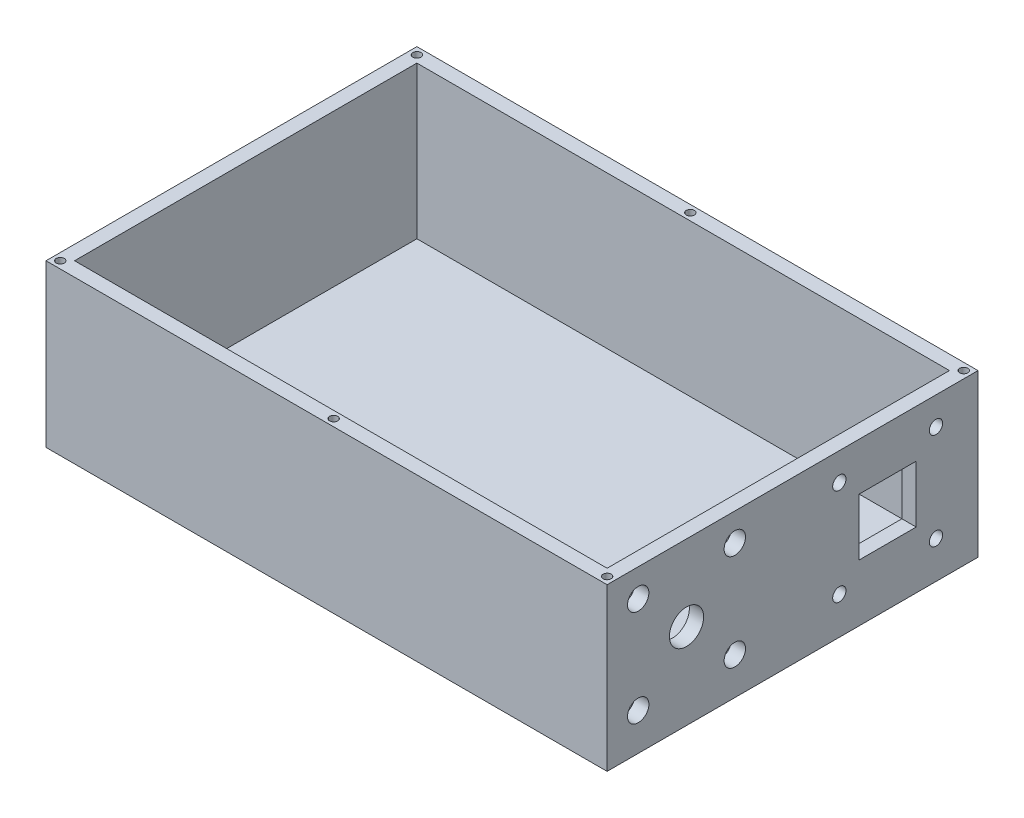
ISO-10303-21;
HEADER;
FILE_DESCRIPTION(('STEP AP214'),'2;1');
FILE_NAME('part.step','',(''),(''),'','','');
FILE_SCHEMA(('AUTOMOTIVE_DESIGN { 1 0 10303 214 1 1 1 1 }'));
ENDSEC;
DATA;
#1=APPLICATION_CONTEXT('core data for automotive mechanical design processes');
#2=APPLICATION_PROTOCOL_DEFINITION('international standard','automotive_design',2000,#1);
#3=PRODUCT_CONTEXT('',#1,'mechanical');
#4=PRODUCT('Part','Part','',(#3));
#5=PRODUCT_RELATED_PRODUCT_CATEGORY('part','',(#4));
#6=PRODUCT_DEFINITION_FORMATION('','',#4);
#7=PRODUCT_DEFINITION_CONTEXT('part definition',#1,'design');
#8=PRODUCT_DEFINITION('design','',#6,#7);
#9=PRODUCT_DEFINITION_SHAPE('','',#8);
#10=(LENGTH_UNIT() NAMED_UNIT(*) SI_UNIT(.MILLI.,.METRE.));
#11=(NAMED_UNIT(*) PLANE_ANGLE_UNIT() SI_UNIT($,.RADIAN.));
#12=(NAMED_UNIT(*) SI_UNIT($,.STERADIAN.) SOLID_ANGLE_UNIT());
#13=UNCERTAINTY_MEASURE_WITH_UNIT(LENGTH_MEASURE(1.E-05),#10,'distance_accuracy_value','');
#14=(GEOMETRIC_REPRESENTATION_CONTEXT(3) GLOBAL_UNCERTAINTY_ASSIGNED_CONTEXT((#13)) GLOBAL_UNIT_ASSIGNED_CONTEXT((#10,
#11,#12)) REPRESENTATION_CONTEXT('',''));
#15=CARTESIAN_POINT('',(0.,0.,0.));
#16=DIRECTION('',(0.,0.,1.));
#17=DIRECTION('',(1.,0.,0.));
#18=AXIS2_PLACEMENT_3D('',#15,#16,#17);
#19=CARTESIAN_POINT('',(59.,34.,-39.));
#20=DIRECTION('',(-1.,0.,0.));
#21=DIRECTION('',(0.,0.,1.));
#22=AXIS2_PLACEMENT_3D('',#19,#20,#21);
#23=PLANE('',#22);
#24=CARTESIAN_POINT('',(59.,28.16,32.46));
#25=DIRECTION('',(-1.,0.,0.));
#26=DIRECTION('',(0.,0.,1.));
#27=AXIS2_PLACEMENT_3D('',#24,#25,#26);
#28=CIRCLE('',#27,2.25);
#29=CARTESIAN_POINT('',(59.,28.16,34.71));
#30=VERTEX_POINT('',#29);
#31=EDGE_CURVE('E510',#30,#30,#28,.T.);
#32=ORIENTED_EDGE('',*,*,#31,.T.);
#33=EDGE_LOOP('',(#32));
#34=FACE_BOUND('',#33,.T.);
#35=CARTESIAN_POINT('',(59.,7.84,12.14));
#36=DIRECTION('',(-1.,0.,0.));
#37=DIRECTION('',(0.,0.,1.));
#38=AXIS2_PLACEMENT_3D('',#35,#36,#37);
#39=CIRCLE('',#38,2.25);
#40=CARTESIAN_POINT('',(59.,7.84,14.39));
#41=VERTEX_POINT('',#40);
#42=EDGE_CURVE('E518',#41,#41,#39,.T.);
#43=ORIENTED_EDGE('',*,*,#42,.T.);
#44=EDGE_LOOP('',(#43));
#45=FACE_BOUND('',#44,.T.);
#46=CARTESIAN_POINT('',(59.,7.84,32.46));
#47=DIRECTION('',(-1.,0.,0.));
#48=DIRECTION('',(0.,0.,1.));
#49=AXIS2_PLACEMENT_3D('',#46,#47,#48);
#50=CIRCLE('',#49,2.25);
#51=CARTESIAN_POINT('',(59.,7.84,34.71));
#52=VERTEX_POINT('',#51);
#53=EDGE_CURVE('E494',#52,#52,#50,.T.);
#54=ORIENTED_EDGE('',*,*,#53,.T.);
#55=EDGE_LOOP('',(#54));
#56=FACE_BOUND('',#55,.T.);
#57=CARTESIAN_POINT('',(59.,18.,22.3));
#58=DIRECTION('',(-1.,0.,0.));
#59=DIRECTION('',(0.,0.,1.));
#60=AXIS2_PLACEMENT_3D('',#57,#58,#59);
#61=CIRCLE('',#60,3.6);
#62=CARTESIAN_POINT('',(59.,18.,25.9));
#63=VERTEX_POINT('',#62);
#64=EDGE_CURVE('E503',#63,#63,#61,.T.);
#65=ORIENTED_EDGE('',*,*,#64,.T.);
#66=EDGE_LOOP('',(#65));
#67=FACE_BOUND('',#66,.T.);
#68=CARTESIAN_POINT('',(59.,28.16,12.14));
#69=DIRECTION('',(-1.,0.,0.));
#70=DIRECTION('',(0.,0.,1.));
#71=AXIS2_PLACEMENT_3D('',#68,#69,#70);
#72=CIRCLE('',#71,2.25);
#73=CARTESIAN_POINT('',(59.,28.16,14.39));
#74=VERTEX_POINT('',#73);
#75=EDGE_CURVE('E204',#74,#74,#72,.T.);
#76=ORIENTED_EDGE('',*,*,#75,.T.);
#77=EDGE_LOOP('',(#76));
#78=FACE_BOUND('',#77,.T.);
#79=CARTESIAN_POINT('',(59.,7.84,-9.84));
#80=DIRECTION('',(-1.,0.,0.));
#81=DIRECTION('',(0.,0.,1.));
#82=AXIS2_PLACEMENT_3D('',#79,#80,#81);
#83=CIRCLE('',#82,1.4);
#84=CARTESIAN_POINT('',(59.,7.84,-8.44));
#85=VERTEX_POINT('',#84);
#86=EDGE_CURVE('E196',#85,#85,#83,.T.);
#87=ORIENTED_EDGE('',*,*,#86,.T.);
#88=EDGE_LOOP('',(#87));
#89=FACE_BOUND('',#88,.T.);
#90=CARTESIAN_POINT('',(59.,7.84,-30.16));
#91=DIRECTION('',(-1.,0.,0.));
#92=DIRECTION('',(0.,0.,1.));
#93=AXIS2_PLACEMENT_3D('',#90,#91,#92);
#94=CIRCLE('',#93,1.4);
#95=CARTESIAN_POINT('',(59.,7.84,-28.76));
#96=VERTEX_POINT('',#95);
#97=EDGE_CURVE('E188',#96,#96,#94,.T.);
#98=ORIENTED_EDGE('',*,*,#97,.T.);
#99=EDGE_LOOP('',(#98));
#100=FACE_BOUND('',#99,.T.);
#101=CARTESIAN_POINT('',(59.,28.16,-9.84));
#102=DIRECTION('',(-1.,0.,0.));
#103=DIRECTION('',(0.,0.,1.));
#104=AXIS2_PLACEMENT_3D('',#101,#102,#103);
#105=CIRCLE('',#104,1.4);
#106=CARTESIAN_POINT('',(59.,28.16,-8.44));
#107=VERTEX_POINT('',#106);
#108=EDGE_CURVE('E166',#107,#107,#105,.T.);
#109=ORIENTED_EDGE('',*,*,#108,.T.);
#110=EDGE_LOOP('',(#109));
#111=FACE_BOUND('',#110,.T.);
#112=DIRECTION('',(0.,0.,1.));
#113=VECTOR('',#112,1.);
#114=CARTESIAN_POINT('',(59.,12.,-26.));
#115=LINE('',#114,#113);
#116=CARTESIAN_POINT('',(59.,12.,-26.));
#117=VERTEX_POINT('',#116);
#118=CARTESIAN_POINT('',(59.,12.,-14.));
#119=VERTEX_POINT('',#118);
#120=EDGE_CURVE('E138',#117,#119,#115,.T.);
#121=ORIENTED_EDGE('',*,*,#120,.T.);
#122=DIRECTION('',(0.,1.,0.));
#123=VECTOR('',#122,1.);
#124=CARTESIAN_POINT('',(59.,24.,-14.));
#125=LINE('',#124,#123);
#126=CARTESIAN_POINT('',(59.,24.,-14.));
#127=VERTEX_POINT('',#126);
#128=EDGE_CURVE('E131',#119,#127,#125,.T.);
#129=ORIENTED_EDGE('',*,*,#128,.T.);
#130=DIRECTION('',(0.,0.,-1.));
#131=VECTOR('',#130,1.);
#132=CARTESIAN_POINT('',(59.,24.,-26.));
#133=LINE('',#132,#131);
#134=CARTESIAN_POINT('',(59.,24.,-26.));
#135=VERTEX_POINT('',#134);
#136=EDGE_CURVE('E141',#127,#135,#133,.T.);
#137=ORIENTED_EDGE('',*,*,#136,.T.);
#138=DIRECTION('',(0.,-1.,0.));
#139=VECTOR('',#138,1.);
#140=CARTESIAN_POINT('',(59.,24.,-26.));
#141=LINE('',#140,#139);
#142=EDGE_CURVE('E55',#135,#117,#141,.T.);
#143=ORIENTED_EDGE('',*,*,#142,.T.);
#144=EDGE_LOOP('',(#121,#129,#137,#143));
#145=FACE_BOUND('',#144,.T.);
#146=CARTESIAN_POINT('',(59.,28.16,-30.16));
#147=DIRECTION('',(-1.,0.,0.));
#148=DIRECTION('',(0.,0.,1.));
#149=AXIS2_PLACEMENT_3D('',#146,#147,#148);
#150=CIRCLE('',#149,1.4);
#151=CARTESIAN_POINT('',(59.,28.16,-28.76));
#152=VERTEX_POINT('',#151);
#153=EDGE_CURVE('E205',#152,#152,#150,.T.);
#154=ORIENTED_EDGE('',*,*,#153,.T.);
#155=EDGE_LOOP('',(#154));
#156=FACE_BOUND('',#155,.T.);
#157=DIRECTION('',(0.,0.,-1.));
#158=VECTOR('',#157,1.);
#159=CARTESIAN_POINT('',(59.,0.,-39.));
#160=LINE('',#159,#158);
#161=CARTESIAN_POINT('',(59.,0.,39.));
#162=VERTEX_POINT('',#161);
#163=CARTESIAN_POINT('',(59.,0.,-39.));
#164=VERTEX_POINT('',#163);
#165=EDGE_CURVE('E247',#162,#164,#160,.T.);
#166=ORIENTED_EDGE('',*,*,#165,.T.);
#167=DIRECTION('',(0.,-1.,0.));
#168=VECTOR('',#167,1.);
#169=CARTESIAN_POINT('',(59.,34.,-39.));
#170=LINE('',#169,#168);
#171=CARTESIAN_POINT('',(59.,34.,-39.));
#172=VERTEX_POINT('',#171);
#173=EDGE_CURVE('E11',#172,#164,#170,.T.);
#174=ORIENTED_EDGE('',*,*,#173,.F.);
#175=DIRECTION('',(0.,0.,-1.));
#176=VECTOR('',#175,1.);
#177=CARTESIAN_POINT('',(59.,34.,-39.));
#178=LINE('',#177,#176);
#179=CARTESIAN_POINT('',(59.,34.,39.));
#180=VERTEX_POINT('',#179);
#181=EDGE_CURVE('E257',#180,#172,#178,.T.);
#182=ORIENTED_EDGE('',*,*,#181,.F.);
#183=DIRECTION('',(0.,-1.,0.));
#184=VECTOR('',#183,1.);
#185=CARTESIAN_POINT('',(59.,34.,39.));
#186=LINE('',#185,#184);
#187=EDGE_CURVE('E271',#180,#162,#186,.T.);
#188=ORIENTED_EDGE('',*,*,#187,.T.);
#189=EDGE_LOOP('',(#166,#174,#182,#188));
#190=FACE_BOUND('',#189,.T.);
#191=ADVANCED_FACE('F40',(#34,#45,#56,#67,#78,#89,#100,#111,#145,#156,#190),#23,.F.);
#192=CARTESIAN_POINT('',(-59.,34.,-39.));
#193=DIRECTION('',(0.,0.,1.));
#194=DIRECTION('',(1.,0.,0.));
#195=AXIS2_PLACEMENT_3D('',#192,#193,#194);
#196=PLANE('',#195);
#197=DIRECTION('',(-1.,0.,0.));
#198=VECTOR('',#197,1.);
#199=CARTESIAN_POINT('',(-59.,0.,-39.));
#200=LINE('',#199,#198);
#201=CARTESIAN_POINT('',(-59.,0.,-39.));
#202=VERTEX_POINT('',#201);
#203=EDGE_CURVE('E275',#164,#202,#200,.T.);
#204=ORIENTED_EDGE('',*,*,#203,.T.);
#205=DIRECTION('',(0.,-1.,0.));
#206=VECTOR('',#205,1.);
#207=CARTESIAN_POINT('',(-59.,34.,-39.));
#208=LINE('',#207,#206);
#209=CARTESIAN_POINT('',(-59.,34.,-39.));
#210=VERTEX_POINT('',#209);
#211=EDGE_CURVE('E48',#210,#202,#208,.T.);
#212=ORIENTED_EDGE('',*,*,#211,.F.);
#213=DIRECTION('',(-1.,0.,0.));
#214=VECTOR('',#213,1.);
#215=CARTESIAN_POINT('',(-59.,34.,-39.));
#216=LINE('',#215,#214);
#217=EDGE_CURVE('E261',#172,#210,#216,.T.);
#218=ORIENTED_EDGE('',*,*,#217,.F.);
#219=ORIENTED_EDGE('',*,*,#173,.T.);
#220=EDGE_LOOP('',(#204,#212,#218,#219));
#221=FACE_BOUND('',#220,.T.);
#222=ADVANCED_FACE('F311',(#221),#196,.F.);
#223=CARTESIAN_POINT('',(-59.,34.,-39.));
#224=DIRECTION('',(1.,0.,0.));
#225=DIRECTION('',(0.,0.,-1.));
#226=AXIS2_PLACEMENT_3D('',#223,#224,#225);
#227=PLANE('',#226);
#228=DIRECTION('',(0.,0.,1.));
#229=VECTOR('',#228,1.);
#230=CARTESIAN_POINT('',(-59.,0.,-39.));
#231=LINE('',#230,#229);
#232=CARTESIAN_POINT('',(-59.,0.,39.));
#233=VERTEX_POINT('',#232);
#234=EDGE_CURVE('E278',#202,#233,#231,.T.);
#235=ORIENTED_EDGE('',*,*,#234,.T.);
#236=DIRECTION('',(0.,-1.,0.));
#237=VECTOR('',#236,1.);
#238=CARTESIAN_POINT('',(-59.,34.,39.));
#239=LINE('',#238,#237);
#240=CARTESIAN_POINT('',(-59.,34.,39.));
#241=VERTEX_POINT('',#240);
#242=EDGE_CURVE('E286',#241,#233,#239,.T.);
#243=ORIENTED_EDGE('',*,*,#242,.F.);
#244=DIRECTION('',(0.,0.,1.));
#245=VECTOR('',#244,1.);
#246=CARTESIAN_POINT('',(-59.,34.,-39.));
#247=LINE('',#246,#245);
#248=EDGE_CURVE('E265',#210,#241,#247,.T.);
#249=ORIENTED_EDGE('',*,*,#248,.F.);
#250=ORIENTED_EDGE('',*,*,#211,.T.);
#251=EDGE_LOOP('',(#235,#243,#249,#250));
#252=FACE_BOUND('',#251,.T.);
#253=ADVANCED_FACE('F295',(#252),#227,.F.);
#254=CARTESIAN_POINT('',(-59.,34.,39.));
#255=DIRECTION('',(0.,0.,-1.));
#256=DIRECTION('',(-1.,0.,0.));
#257=AXIS2_PLACEMENT_3D('',#254,#255,#256);
#258=PLANE('',#257);
#259=DIRECTION('',(1.,0.,0.));
#260=VECTOR('',#259,1.);
#261=CARTESIAN_POINT('',(-59.,0.,39.));
#262=LINE('',#261,#260);
#263=EDGE_CURVE('E262',#233,#162,#262,.T.);
#264=ORIENTED_EDGE('',*,*,#263,.T.);
#265=ORIENTED_EDGE('',*,*,#187,.F.);
#266=DIRECTION('',(1.,0.,0.));
#267=VECTOR('',#266,1.);
#268=CARTESIAN_POINT('',(-59.,34.,39.));
#269=LINE('',#268,#267);
#270=EDGE_CURVE('E268',#241,#180,#269,.T.);
#271=ORIENTED_EDGE('',*,*,#270,.F.);
#272=ORIENTED_EDGE('',*,*,#242,.T.);
#273=EDGE_LOOP('',(#264,#265,#271,#272));
#274=FACE_BOUND('',#273,.T.);
#275=ADVANCED_FACE('F304',(#274),#258,.F.);
#276=CARTESIAN_POINT('',(0.,34.,0.));
#277=DIRECTION('',(0.,1.,0.));
#278=DIRECTION('',(0.,0.,1.));
#279=AXIS2_PLACEMENT_3D('',#276,#277,#278);
#280=PLANE('',#279);
#281=CARTESIAN_POINT('',(-57.5,34.,37.5));
#282=DIRECTION('',(0.,1.,0.));
#283=DIRECTION('',(0.,0.,1.));
#284=AXIS2_PLACEMENT_3D('',#281,#282,#283);
#285=CIRCLE('',#284,0.849999999999999);
#286=CARTESIAN_POINT('',(-57.5,34.,38.35));
#287=VERTEX_POINT('',#286);
#288=EDGE_CURVE('E463',#287,#287,#285,.T.);
#289=ORIENTED_EDGE('',*,*,#288,.F.);
#290=EDGE_LOOP('',(#289));
#291=FACE_BOUND('',#290,.T.);
#292=CARTESIAN_POINT('',(57.5,34.,37.5));
#293=DIRECTION('',(0.,1.,0.));
#294=DIRECTION('',(0.,0.,1.));
#295=AXIS2_PLACEMENT_3D('',#292,#293,#294);
#296=CIRCLE('',#295,0.849999999999999);
#297=CARTESIAN_POINT('',(57.5,34.,38.35));
#298=VERTEX_POINT('',#297);
#299=EDGE_CURVE('E471',#298,#298,#296,.T.);
#300=ORIENTED_EDGE('',*,*,#299,.F.);
#301=EDGE_LOOP('',(#300));
#302=FACE_BOUND('',#301,.T.);
#303=CARTESIAN_POINT('',(57.5,34.,-37.5));
#304=DIRECTION('',(0.,1.,0.));
#305=DIRECTION('',(0.,0.,1.));
#306=AXIS2_PLACEMENT_3D('',#303,#304,#305);
#307=CIRCLE('',#306,0.849999999999999);
#308=CARTESIAN_POINT('',(57.5,34.,-36.65));
#309=VERTEX_POINT('',#308);
#310=EDGE_CURVE('E479',#309,#309,#307,.T.);
#311=ORIENTED_EDGE('',*,*,#310,.F.);
#312=EDGE_LOOP('',(#311));
#313=FACE_BOUND('',#312,.T.);
#314=CARTESIAN_POINT('',(0.,34.,-37.5));
#315=DIRECTION('',(0.,1.,0.));
#316=DIRECTION('',(0.,0.,1.));
#317=AXIS2_PLACEMENT_3D('',#314,#315,#316);
#318=CIRCLE('',#317,0.849999999999999);
#319=CARTESIAN_POINT('',(0.,34.,-36.65));
#320=VERTEX_POINT('',#319);
#321=EDGE_CURVE('E447',#320,#320,#318,.T.);
#322=ORIENTED_EDGE('',*,*,#321,.F.);
#323=EDGE_LOOP('',(#322));
#324=FACE_BOUND('',#323,.T.);
#325=CARTESIAN_POINT('',(0.,34.,37.5));
#326=DIRECTION('',(0.,1.,0.));
#327=DIRECTION('',(0.,0.,1.));
#328=AXIS2_PLACEMENT_3D('',#325,#326,#327);
#329=CIRCLE('',#328,0.850000000000001);
#330=CARTESIAN_POINT('',(0.,34.,38.35));
#331=VERTEX_POINT('',#330);
#332=EDGE_CURVE('E448',#331,#331,#329,.T.);
#333=ORIENTED_EDGE('',*,*,#332,.F.);
#334=EDGE_LOOP('',(#333));
#335=FACE_BOUND('',#334,.T.);
#336=CARTESIAN_POINT('',(-57.5,34.,-37.5));
#337=DIRECTION('',(0.,1.,0.));
#338=DIRECTION('',(0.,0.,1.));
#339=AXIS2_PLACEMENT_3D('',#336,#337,#338);
#340=CIRCLE('',#339,0.849999999999999);
#341=CARTESIAN_POINT('',(-57.5,34.,-36.65));
#342=VERTEX_POINT('',#341);
#343=EDGE_CURVE('E462',#342,#342,#340,.T.);
#344=ORIENTED_EDGE('',*,*,#343,.F.);
#345=EDGE_LOOP('',(#344));
#346=FACE_BOUND('',#345,.T.);
#347=DIRECTION('',(0.,0.,-1.));
#348=VECTOR('',#347,1.);
#349=CARTESIAN_POINT('',(56.,34.,-36.));
#350=LINE('',#349,#348);
#351=CARTESIAN_POINT('',(56.,34.,36.));
#352=VERTEX_POINT('',#351);
#353=CARTESIAN_POINT('',(56.,34.,-36.));
#354=VERTEX_POINT('',#353);
#355=EDGE_CURVE('E209',#352,#354,#350,.T.);
#356=ORIENTED_EDGE('',*,*,#355,.F.);
#357=DIRECTION('',(1.,0.,0.));
#358=VECTOR('',#357,1.);
#359=CARTESIAN_POINT('',(-56.,34.,36.));
#360=LINE('',#359,#358);
#361=CARTESIAN_POINT('',(-56.,34.,36.));
#362=VERTEX_POINT('',#361);
#363=EDGE_CURVE('E218',#362,#352,#360,.T.);
#364=ORIENTED_EDGE('',*,*,#363,.F.);
#365=DIRECTION('',(0.,0.,1.));
#366=VECTOR('',#365,1.);
#367=CARTESIAN_POINT('',(-56.,34.,-36.));
#368=LINE('',#367,#366);
#369=CARTESIAN_POINT('',(-56.,34.,-36.));
#370=VERTEX_POINT('',#369);
#371=EDGE_CURVE('E237',#370,#362,#368,.T.);
#372=ORIENTED_EDGE('',*,*,#371,.F.);
#373=DIRECTION('',(-1.,0.,0.));
#374=VECTOR('',#373,1.);
#375=CARTESIAN_POINT('',(-56.,34.,-36.));
#376=LINE('',#375,#374);
#377=EDGE_CURVE('E233',#354,#370,#376,.T.);
#378=ORIENTED_EDGE('',*,*,#377,.F.);
#379=EDGE_LOOP('',(#356,#364,#372,#378));
#380=FACE_BOUND('',#379,.T.);
#381=ORIENTED_EDGE('',*,*,#181,.T.);
#382=ORIENTED_EDGE('',*,*,#217,.T.);
#383=ORIENTED_EDGE('',*,*,#248,.T.);
#384=ORIENTED_EDGE('',*,*,#270,.T.);
#385=EDGE_LOOP('',(#381,#382,#383,#384));
#386=FACE_BOUND('',#385,.T.);
#387=ADVANCED_FACE('F310',(#291,#302,#313,#324,#335,#346,#380,#386),#280,.T.);
#388=CARTESIAN_POINT('',(0.,0.,0.));
#389=DIRECTION('',(0.,1.,0.));
#390=DIRECTION('',(0.,0.,1.));
#391=AXIS2_PLACEMENT_3D('',#388,#389,#390);
#392=PLANE('',#391);
#393=ORIENTED_EDGE('',*,*,#165,.F.);
#394=ORIENTED_EDGE('',*,*,#263,.F.);
#395=ORIENTED_EDGE('',*,*,#234,.F.);
#396=ORIENTED_EDGE('',*,*,#203,.F.);
#397=EDGE_LOOP('',(#393,#394,#395,#396));
#398=FACE_BOUND('',#397,.T.);
#399=ADVANCED_FACE('F301',(#398),#392,.F.);
#400=CARTESIAN_POINT('',(56.,2.,-36.));
#401=DIRECTION('',(1.,0.,0.));
#402=DIRECTION('',(0.,0.,-1.));
#403=AXIS2_PLACEMENT_3D('',#400,#401,#402);
#404=PLANE('',#403);
#405=CARTESIAN_POINT('',(56.,28.16,32.46));
#406=DIRECTION('',(-1.,0.,0.));
#407=DIRECTION('',(0.,0.,1.));
#408=AXIS2_PLACEMENT_3D('',#405,#406,#407);
#409=CIRCLE('',#408,2.25);
#410=CARTESIAN_POINT('',(56.,28.16,34.71));
#411=VERTEX_POINT('',#410);
#412=EDGE_CURVE('E514',#411,#411,#409,.T.);
#413=ORIENTED_EDGE('',*,*,#412,.F.);
#414=EDGE_LOOP('',(#413));
#415=FACE_BOUND('',#414,.T.);
#416=CARTESIAN_POINT('',(56.,7.84,12.14));
#417=DIRECTION('',(-1.,0.,0.));
#418=DIRECTION('',(0.,0.,1.));
#419=AXIS2_PLACEMENT_3D('',#416,#417,#418);
#420=CIRCLE('',#419,2.25);
#421=CARTESIAN_POINT('',(56.,7.84,14.39));
#422=VERTEX_POINT('',#421);
#423=EDGE_CURVE('E498',#422,#422,#420,.T.);
#424=ORIENTED_EDGE('',*,*,#423,.F.);
#425=EDGE_LOOP('',(#424));
#426=FACE_BOUND('',#425,.T.);
#427=CARTESIAN_POINT('',(56.,7.84,32.46));
#428=DIRECTION('',(-1.,0.,0.));
#429=DIRECTION('',(0.,0.,1.));
#430=AXIS2_PLACEMENT_3D('',#427,#428,#429);
#431=CIRCLE('',#430,2.25);
#432=CARTESIAN_POINT('',(56.,7.84,34.71));
#433=VERTEX_POINT('',#432);
#434=EDGE_CURVE('E499',#433,#433,#431,.T.);
#435=ORIENTED_EDGE('',*,*,#434,.F.);
#436=EDGE_LOOP('',(#435));
#437=FACE_BOUND('',#436,.T.);
#438=CARTESIAN_POINT('',(56.,18.,22.3));
#439=DIRECTION('',(-1.,0.,0.));
#440=DIRECTION('',(0.,0.,1.));
#441=AXIS2_PLACEMENT_3D('',#438,#439,#440);
#442=CIRCLE('',#441,3.6);
#443=CARTESIAN_POINT('',(56.,18.,25.9));
#444=VERTEX_POINT('',#443);
#445=EDGE_CURVE('E490',#444,#444,#442,.T.);
#446=ORIENTED_EDGE('',*,*,#445,.F.);
#447=EDGE_LOOP('',(#446));
#448=FACE_BOUND('',#447,.T.);
#449=CARTESIAN_POINT('',(56.,28.16,12.14));
#450=DIRECTION('',(-1.,0.,0.));
#451=DIRECTION('',(0.,0.,1.));
#452=AXIS2_PLACEMENT_3D('',#449,#450,#451);
#453=CIRCLE('',#452,2.25);
#454=CARTESIAN_POINT('',(56.,28.16,14.39));
#455=VERTEX_POINT('',#454);
#456=EDGE_CURVE('E156',#455,#455,#453,.T.);
#457=ORIENTED_EDGE('',*,*,#456,.F.);
#458=EDGE_LOOP('',(#457));
#459=FACE_BOUND('',#458,.T.);
#460=CARTESIAN_POINT('',(56.,7.84,-9.84));
#461=DIRECTION('',(-1.,0.,0.));
#462=DIRECTION('',(0.,0.,1.));
#463=AXIS2_PLACEMENT_3D('',#460,#461,#462);
#464=CIRCLE('',#463,1.4);
#465=CARTESIAN_POINT('',(56.,7.84,-8.44));
#466=VERTEX_POINT('',#465);
#467=EDGE_CURVE('E200',#466,#466,#464,.T.);
#468=ORIENTED_EDGE('',*,*,#467,.F.);
#469=EDGE_LOOP('',(#468));
#470=FACE_BOUND('',#469,.T.);
#471=CARTESIAN_POINT('',(56.,7.84,-30.16));
#472=DIRECTION('',(-1.,0.,0.));
#473=DIRECTION('',(0.,0.,1.));
#474=AXIS2_PLACEMENT_3D('',#471,#472,#473);
#475=CIRCLE('',#474,1.4);
#476=CARTESIAN_POINT('',(56.,7.84,-28.76));
#477=VERTEX_POINT('',#476);
#478=EDGE_CURVE('E192',#477,#477,#475,.T.);
#479=ORIENTED_EDGE('',*,*,#478,.F.);
#480=EDGE_LOOP('',(#479));
#481=FACE_BOUND('',#480,.T.);
#482=CARTESIAN_POINT('',(56.,28.16,-9.84));
#483=DIRECTION('',(-1.,0.,0.));
#484=DIRECTION('',(0.,0.,1.));
#485=AXIS2_PLACEMENT_3D('',#482,#483,#484);
#486=CIRCLE('',#485,1.4);
#487=CARTESIAN_POINT('',(56.,28.16,-8.44));
#488=VERTEX_POINT('',#487);
#489=EDGE_CURVE('E184',#488,#488,#486,.T.);
#490=ORIENTED_EDGE('',*,*,#489,.F.);
#491=EDGE_LOOP('',(#490));
#492=FACE_BOUND('',#491,.T.);
#493=DIRECTION('',(0.,0.,-1.));
#494=VECTOR('',#493,1.);
#495=CARTESIAN_POINT('',(56.,24.,-26.));
#496=LINE('',#495,#494);
#497=CARTESIAN_POINT('',(56.,24.,-14.));
#498=VERTEX_POINT('',#497);
#499=CARTESIAN_POINT('',(56.,24.,-26.));
#500=VERTEX_POINT('',#499);
#501=EDGE_CURVE('E165',#498,#500,#496,.T.);
#502=ORIENTED_EDGE('',*,*,#501,.F.);
#503=DIRECTION('',(0.,1.,0.));
#504=VECTOR('',#503,1.);
#505=CARTESIAN_POINT('',(56.,24.,-14.));
#506=LINE('',#505,#504);
#507=CARTESIAN_POINT('',(56.,12.,-14.));
#508=VERTEX_POINT('',#507);
#509=EDGE_CURVE('E63',#508,#498,#506,.T.);
#510=ORIENTED_EDGE('',*,*,#509,.F.);
#511=DIRECTION('',(0.,0.,1.));
#512=VECTOR('',#511,1.);
#513=CARTESIAN_POINT('',(56.,12.,-26.));
#514=LINE('',#513,#512);
#515=CARTESIAN_POINT('',(56.,12.,-26.));
#516=VERTEX_POINT('',#515);
#517=EDGE_CURVE('E149',#516,#508,#514,.T.);
#518=ORIENTED_EDGE('',*,*,#517,.F.);
#519=DIRECTION('',(0.,-1.,0.));
#520=VECTOR('',#519,1.);
#521=CARTESIAN_POINT('',(56.,24.,-26.));
#522=LINE('',#521,#520);
#523=EDGE_CURVE('E153',#500,#516,#522,.T.);
#524=ORIENTED_EDGE('',*,*,#523,.F.);
#525=EDGE_LOOP('',(#502,#510,#518,#524));
#526=FACE_BOUND('',#525,.T.);
#527=CARTESIAN_POINT('',(56.,28.16,-30.16));
#528=DIRECTION('',(-1.,0.,0.));
#529=DIRECTION('',(0.,0.,1.));
#530=AXIS2_PLACEMENT_3D('',#527,#528,#529);
#531=CIRCLE('',#530,1.4);
#532=CARTESIAN_POINT('',(56.,28.16,-28.76));
#533=VERTEX_POINT('',#532);
#534=EDGE_CURVE('E175',#533,#533,#531,.T.);
#535=ORIENTED_EDGE('',*,*,#534,.F.);
#536=EDGE_LOOP('',(#535));
#537=FACE_BOUND('',#536,.T.);
#538=ORIENTED_EDGE('',*,*,#355,.T.);
#539=DIRECTION('',(0.,1.,0.));
#540=VECTOR('',#539,1.);
#541=CARTESIAN_POINT('',(56.,2.,-36.));
#542=LINE('',#541,#540);
#543=CARTESIAN_POINT('',(56.,2.,-36.));
#544=VERTEX_POINT('',#543);
#545=EDGE_CURVE('E230',#544,#354,#542,.T.);
#546=ORIENTED_EDGE('',*,*,#545,.F.);
#547=DIRECTION('',(0.,0.,-1.));
#548=VECTOR('',#547,1.);
#549=CARTESIAN_POINT('',(56.,2.,-36.));
#550=LINE('',#549,#548);
#551=CARTESIAN_POINT('',(56.,2.,36.));
#552=VERTEX_POINT('',#551);
#553=EDGE_CURVE('E213',#552,#544,#550,.T.);
#554=ORIENTED_EDGE('',*,*,#553,.F.);
#555=DIRECTION('',(0.,1.,0.));
#556=VECTOR('',#555,1.);
#557=CARTESIAN_POINT('',(56.,2.,36.));
#558=LINE('',#557,#556);
#559=EDGE_CURVE('E244',#552,#352,#558,.T.);
#560=ORIENTED_EDGE('',*,*,#559,.T.);
#561=EDGE_LOOP('',(#538,#546,#554,#560));
#562=FACE_BOUND('',#561,.T.);
#563=ADVANCED_FACE('F324',(#415,#426,#437,#448,#459,#470,#481,#492,#526,#537,#562),#404,.F.);
#564=CARTESIAN_POINT('',(-56.,2.,36.));
#565=DIRECTION('',(0.,0.,1.));
#566=DIRECTION('',(1.,0.,0.));
#567=AXIS2_PLACEMENT_3D('',#564,#565,#566);
#568=PLANE('',#567);
#569=ORIENTED_EDGE('',*,*,#363,.T.);
#570=ORIENTED_EDGE('',*,*,#559,.F.);
#571=DIRECTION('',(1.,0.,0.));
#572=VECTOR('',#571,1.);
#573=CARTESIAN_POINT('',(-56.,2.,36.));
#574=LINE('',#573,#572);
#575=CARTESIAN_POINT('',(-56.,2.,36.));
#576=VERTEX_POINT('',#575);
#577=EDGE_CURVE('E226',#576,#552,#574,.T.);
#578=ORIENTED_EDGE('',*,*,#577,.F.);
#579=DIRECTION('',(0.,1.,0.));
#580=VECTOR('',#579,1.);
#581=CARTESIAN_POINT('',(-56.,2.,36.));
#582=LINE('',#581,#580);
#583=EDGE_CURVE('E248',#576,#362,#582,.T.);
#584=ORIENTED_EDGE('',*,*,#583,.T.);
#585=EDGE_LOOP('',(#569,#570,#578,#584));
#586=FACE_BOUND('',#585,.T.);
#587=ADVANCED_FACE('F330',(#586),#568,.F.);
#588=CARTESIAN_POINT('',(-56.,2.,-36.));
#589=DIRECTION('',(-1.,0.,0.));
#590=DIRECTION('',(0.,0.,1.));
#591=AXIS2_PLACEMENT_3D('',#588,#589,#590);
#592=PLANE('',#591);
#593=ORIENTED_EDGE('',*,*,#371,.T.);
#594=ORIENTED_EDGE('',*,*,#583,.F.);
#595=DIRECTION('',(0.,0.,1.));
#596=VECTOR('',#595,1.);
#597=CARTESIAN_POINT('',(-56.,2.,-36.));
#598=LINE('',#597,#596);
#599=CARTESIAN_POINT('',(-56.,2.,-36.));
#600=VERTEX_POINT('',#599);
#601=EDGE_CURVE('E222',#600,#576,#598,.T.);
#602=ORIENTED_EDGE('',*,*,#601,.F.);
#603=DIRECTION('',(0.,1.,0.));
#604=VECTOR('',#603,1.);
#605=CARTESIAN_POINT('',(-56.,2.,-36.));
#606=LINE('',#605,#604);
#607=EDGE_CURVE('E251',#600,#370,#606,.T.);
#608=ORIENTED_EDGE('',*,*,#607,.T.);
#609=EDGE_LOOP('',(#593,#594,#602,#608));
#610=FACE_BOUND('',#609,.T.);
#611=ADVANCED_FACE('F336',(#610),#592,.F.);
#612=CARTESIAN_POINT('',(-56.,2.,-36.));
#613=DIRECTION('',(0.,0.,-1.));
#614=DIRECTION('',(-1.,0.,0.));
#615=AXIS2_PLACEMENT_3D('',#612,#613,#614);
#616=PLANE('',#615);
#617=ORIENTED_EDGE('',*,*,#377,.T.);
#618=ORIENTED_EDGE('',*,*,#607,.F.);
#619=DIRECTION('',(-1.,0.,0.));
#620=VECTOR('',#619,1.);
#621=CARTESIAN_POINT('',(-56.,2.,-36.));
#622=LINE('',#621,#620);
#623=EDGE_CURVE('E217',#544,#600,#622,.T.);
#624=ORIENTED_EDGE('',*,*,#623,.F.);
#625=ORIENTED_EDGE('',*,*,#545,.T.);
#626=EDGE_LOOP('',(#617,#618,#624,#625));
#627=FACE_BOUND('',#626,.T.);
#628=ADVANCED_FACE('F332',(#627),#616,.F.);
#629=CARTESIAN_POINT('',(0.,2.,0.));
#630=DIRECTION('',(0.,1.,0.));
#631=DIRECTION('',(0.,0.,1.));
#632=AXIS2_PLACEMENT_3D('',#629,#630,#631);
#633=PLANE('',#632);
#634=ORIENTED_EDGE('',*,*,#553,.T.);
#635=ORIENTED_EDGE('',*,*,#623,.T.);
#636=ORIENTED_EDGE('',*,*,#601,.T.);
#637=ORIENTED_EDGE('',*,*,#577,.T.);
#638=EDGE_LOOP('',(#634,#635,#636,#637));
#639=FACE_BOUND('',#638,.T.);
#640=ADVANCED_FACE('F335',(#639),#633,.T.);
#641=CARTESIAN_POINT('',(59.,28.16,-30.16));
#642=DIRECTION('',(-1.,0.,0.));
#643=DIRECTION('',(0.,0.,1.));
#644=AXIS2_PLACEMENT_3D('',#641,#642,#643);
#645=CYLINDRICAL_SURFACE('',#644,1.4);
#646=ORIENTED_EDGE('',*,*,#153,.F.);
#647=EDGE_LOOP('',(#646));
#648=FACE_BOUND('',#647,.T.);
#649=ORIENTED_EDGE('',*,*,#534,.T.);
#650=EDGE_LOOP('',(#649));
#651=FACE_BOUND('',#650,.T.);
#652=ADVANCED_FACE('F346',(#648,#651),#645,.F.);
#653=CARTESIAN_POINT('',(59.,24.,-14.));
#654=DIRECTION('',(0.,0.,1.));
#655=DIRECTION('',(1.,0.,0.));
#656=AXIS2_PLACEMENT_3D('',#653,#654,#655);
#657=PLANE('',#656);
#658=ORIENTED_EDGE('',*,*,#509,.T.);
#659=DIRECTION('',(-1.,0.,0.));
#660=VECTOR('',#659,1.);
#661=CARTESIAN_POINT('',(59.,24.,-14.));
#662=LINE('',#661,#660);
#663=EDGE_CURVE('E127',#127,#498,#662,.T.);
#664=ORIENTED_EDGE('',*,*,#663,.F.);
#665=ORIENTED_EDGE('',*,*,#128,.F.);
#666=DIRECTION('',(-1.,0.,0.));
#667=VECTOR('',#666,1.);
#668=CARTESIAN_POINT('',(59.,12.,-14.));
#669=LINE('',#668,#667);
#670=EDGE_CURVE('E172',#119,#508,#669,.T.);
#671=ORIENTED_EDGE('',*,*,#670,.T.);
#672=EDGE_LOOP('',(#658,#664,#665,#671));
#673=FACE_BOUND('',#672,.T.);
#674=ADVANCED_FACE('F129',(#673),#657,.F.);
#675=CARTESIAN_POINT('',(59.,12.,-26.));
#676=DIRECTION('',(0.,-1.,0.));
#677=DIRECTION('',(0.,0.,-1.));
#678=AXIS2_PLACEMENT_3D('',#675,#676,#677);
#679=PLANE('',#678);
#680=ORIENTED_EDGE('',*,*,#517,.T.);
#681=ORIENTED_EDGE('',*,*,#670,.F.);
#682=ORIENTED_EDGE('',*,*,#120,.F.);
#683=DIRECTION('',(-1.,0.,0.));
#684=VECTOR('',#683,1.);
#685=CARTESIAN_POINT('',(59.,12.,-26.));
#686=LINE('',#685,#684);
#687=EDGE_CURVE('E176',#117,#516,#686,.T.);
#688=ORIENTED_EDGE('',*,*,#687,.T.);
#689=EDGE_LOOP('',(#680,#681,#682,#688));
#690=FACE_BOUND('',#689,.T.);
#691=ADVANCED_FACE('F366',(#690),#679,.F.);
#692=CARTESIAN_POINT('',(59.,24.,-26.));
#693=DIRECTION('',(0.,0.,-1.));
#694=DIRECTION('',(0.,1.,0.));
#695=AXIS2_PLACEMENT_3D('',#692,#693,#694);
#696=PLANE('',#695);
#697=ORIENTED_EDGE('',*,*,#523,.T.);
#698=ORIENTED_EDGE('',*,*,#687,.F.);
#699=ORIENTED_EDGE('',*,*,#142,.F.);
#700=DIRECTION('',(-1.,0.,0.));
#701=VECTOR('',#700,1.);
#702=CARTESIAN_POINT('',(59.,24.,-26.));
#703=LINE('',#702,#701);
#704=EDGE_CURVE('E137',#135,#500,#703,.T.);
#705=ORIENTED_EDGE('',*,*,#704,.T.);
#706=EDGE_LOOP('',(#697,#698,#699,#705));
#707=FACE_BOUND('',#706,.T.);
#708=ADVANCED_FACE('F369',(#707),#696,.F.);
#709=CARTESIAN_POINT('',(59.,24.,-26.));
#710=DIRECTION('',(0.,1.,0.));
#711=DIRECTION('',(0.,0.,1.));
#712=AXIS2_PLACEMENT_3D('',#709,#710,#711);
#713=PLANE('',#712);
#714=ORIENTED_EDGE('',*,*,#501,.T.);
#715=ORIENTED_EDGE('',*,*,#704,.F.);
#716=ORIENTED_EDGE('',*,*,#136,.F.);
#717=ORIENTED_EDGE('',*,*,#663,.T.);
#718=EDGE_LOOP('',(#714,#715,#716,#717));
#719=FACE_BOUND('',#718,.T.);
#720=ADVANCED_FACE('F142',(#719),#713,.F.);
#721=CARTESIAN_POINT('',(59.,28.16,-9.84));
#722=DIRECTION('',(-1.,0.,0.));
#723=DIRECTION('',(0.,0.,1.));
#724=AXIS2_PLACEMENT_3D('',#721,#722,#723);
#725=CYLINDRICAL_SURFACE('',#724,1.4);
#726=ORIENTED_EDGE('',*,*,#108,.F.);
#727=EDGE_LOOP('',(#726));
#728=FACE_BOUND('',#727,.T.);
#729=ORIENTED_EDGE('',*,*,#489,.T.);
#730=EDGE_LOOP('',(#729));
#731=FACE_BOUND('',#730,.T.);
#732=ADVANCED_FACE('F359',(#728,#731),#725,.F.);
#733=CARTESIAN_POINT('',(59.,7.84,-30.16));
#734=DIRECTION('',(-1.,0.,0.));
#735=DIRECTION('',(0.,0.,1.));
#736=AXIS2_PLACEMENT_3D('',#733,#734,#735);
#737=CYLINDRICAL_SURFACE('',#736,1.4);
#738=ORIENTED_EDGE('',*,*,#97,.F.);
#739=EDGE_LOOP('',(#738));
#740=FACE_BOUND('',#739,.T.);
#741=ORIENTED_EDGE('',*,*,#478,.T.);
#742=EDGE_LOOP('',(#741));
#743=FACE_BOUND('',#742,.T.);
#744=ADVANCED_FACE('F355',(#740,#743),#737,.F.);
#745=CARTESIAN_POINT('',(59.,7.84,-9.84));
#746=DIRECTION('',(-1.,0.,0.));
#747=DIRECTION('',(0.,0.,1.));
#748=AXIS2_PLACEMENT_3D('',#745,#746,#747);
#749=CYLINDRICAL_SURFACE('',#748,1.4);
#750=ORIENTED_EDGE('',*,*,#86,.F.);
#751=EDGE_LOOP('',(#750));
#752=FACE_BOUND('',#751,.T.);
#753=ORIENTED_EDGE('',*,*,#467,.T.);
#754=EDGE_LOOP('',(#753));
#755=FACE_BOUND('',#754,.T.);
#756=ADVANCED_FACE('F351',(#752,#755),#749,.F.);
#757=CARTESIAN_POINT('',(59.,28.16,12.14));
#758=DIRECTION('',(-1.,0.,0.));
#759=DIRECTION('',(0.,0.,1.));
#760=AXIS2_PLACEMENT_3D('',#757,#758,#759);
#761=CYLINDRICAL_SURFACE('',#760,2.25);
#762=ORIENTED_EDGE('',*,*,#75,.F.);
#763=EDGE_LOOP('',(#762));
#764=FACE_BOUND('',#763,.T.);
#765=ORIENTED_EDGE('',*,*,#456,.T.);
#766=EDGE_LOOP('',(#765));
#767=FACE_BOUND('',#766,.T.);
#768=ADVANCED_FACE('F354',(#764,#767),#761,.F.);
#769=CARTESIAN_POINT('',(59.,18.,22.3));
#770=DIRECTION('',(-1.,0.,0.));
#771=DIRECTION('',(0.,0.,1.));
#772=AXIS2_PLACEMENT_3D('',#769,#770,#771);
#773=CYLINDRICAL_SURFACE('',#772,3.6);
#774=ORIENTED_EDGE('',*,*,#64,.F.);
#775=EDGE_LOOP('',(#774));
#776=FACE_BOUND('',#775,.T.);
#777=ORIENTED_EDGE('',*,*,#445,.T.);
#778=EDGE_LOOP('',(#777));
#779=FACE_BOUND('',#778,.T.);
#780=ADVANCED_FACE('F377',(#776,#779),#773,.F.);
#781=CARTESIAN_POINT('',(59.,7.84,32.46));
#782=DIRECTION('',(-1.,0.,0.));
#783=DIRECTION('',(0.,0.,1.));
#784=AXIS2_PLACEMENT_3D('',#781,#782,#783);
#785=CYLINDRICAL_SURFACE('',#784,2.25);
#786=ORIENTED_EDGE('',*,*,#53,.F.);
#787=EDGE_LOOP('',(#786));
#788=FACE_BOUND('',#787,.T.);
#789=ORIENTED_EDGE('',*,*,#434,.T.);
#790=EDGE_LOOP('',(#789));
#791=FACE_BOUND('',#790,.T.);
#792=ADVANCED_FACE('F383',(#788,#791),#785,.F.);
#793=CARTESIAN_POINT('',(59.,7.84,12.14));
#794=DIRECTION('',(-1.,0.,0.));
#795=DIRECTION('',(0.,0.,1.));
#796=AXIS2_PLACEMENT_3D('',#793,#794,#795);
#797=CYLINDRICAL_SURFACE('',#796,2.25);
#798=ORIENTED_EDGE('',*,*,#42,.F.);
#799=EDGE_LOOP('',(#798));
#800=FACE_BOUND('',#799,.T.);
#801=ORIENTED_EDGE('',*,*,#423,.T.);
#802=EDGE_LOOP('',(#801));
#803=FACE_BOUND('',#802,.T.);
#804=ADVANCED_FACE('F379',(#800,#803),#797,.F.);
#805=CARTESIAN_POINT('',(59.,28.16,32.46));
#806=DIRECTION('',(-1.,0.,0.));
#807=DIRECTION('',(0.,0.,1.));
#808=AXIS2_PLACEMENT_3D('',#805,#806,#807);
#809=CYLINDRICAL_SURFACE('',#808,2.25);
#810=ORIENTED_EDGE('',*,*,#31,.F.);
#811=EDGE_LOOP('',(#810));
#812=FACE_BOUND('',#811,.T.);
#813=ORIENTED_EDGE('',*,*,#412,.T.);
#814=EDGE_LOOP('',(#813));
#815=FACE_BOUND('',#814,.T.);
#816=ADVANCED_FACE('F382',(#812,#815),#809,.F.);
#817=CARTESIAN_POINT('',(-57.5,30.,-37.5));
#818=DIRECTION('',(0.,1.,0.));
#819=DIRECTION('',(0.,0.,1.));
#820=AXIS2_PLACEMENT_3D('',#817,#818,#819);
#821=CYLINDRICAL_SURFACE('',#820,0.849999999999999);
#822=CARTESIAN_POINT('',(-57.5,30.,-37.5));
#823=DIRECTION('',(0.,1.,0.));
#824=DIRECTION('',(0.,0.,1.));
#825=AXIS2_PLACEMENT_3D('',#822,#823,#824);
#826=CIRCLE('',#825,0.849999999999999);
#827=CARTESIAN_POINT('',(-57.5,30.,-36.65));
#828=VERTEX_POINT('',#827);
#829=EDGE_CURVE('E486',#828,#828,#826,.T.);
#830=ORIENTED_EDGE('',*,*,#829,.F.);
#831=EDGE_LOOP('',(#830));
#832=FACE_BOUND('',#831,.T.);
#833=ORIENTED_EDGE('',*,*,#343,.T.);
#834=EDGE_LOOP('',(#833));
#835=FACE_BOUND('',#834,.T.);
#836=ADVANCED_FACE('F387',(#832,#835),#821,.F.);
#837=CARTESIAN_POINT('',(-57.5,30.,-37.5));
#838=DIRECTION('',(0.,1.,0.));
#839=DIRECTION('',(0.,0.,1.));
#840=AXIS2_PLACEMENT_3D('',#837,#838,#839);
#841=PLANE('',#840);
#842=ORIENTED_EDGE('',*,*,#829,.T.);
#843=EDGE_LOOP('',(#842));
#844=FACE_BOUND('',#843,.T.);
#845=ADVANCED_FACE('F397',(#844),#841,.T.);
#846=CARTESIAN_POINT('',(0.,30.,37.5));
#847=DIRECTION('',(0.,1.,0.));
#848=DIRECTION('',(0.,0.,1.));
#849=AXIS2_PLACEMENT_3D('',#846,#847,#848);
#850=CYLINDRICAL_SURFACE('',#849,0.850000000000001);
#851=CARTESIAN_POINT('',(0.,30.,37.5));
#852=DIRECTION('',(0.,1.,0.));
#853=DIRECTION('',(0.,0.,1.));
#854=AXIS2_PLACEMENT_3D('',#851,#852,#853);
#855=CIRCLE('',#854,0.850000000000001);
#856=CARTESIAN_POINT('',(0.,30.,38.35));
#857=VERTEX_POINT('',#856);
#858=EDGE_CURVE('E445',#857,#857,#855,.T.);
#859=ORIENTED_EDGE('',*,*,#858,.F.);
#860=EDGE_LOOP('',(#859));
#861=FACE_BOUND('',#860,.T.);
#862=ORIENTED_EDGE('',*,*,#332,.T.);
#863=EDGE_LOOP('',(#862));
#864=FACE_BOUND('',#863,.T.);
#865=ADVANCED_FACE('F401',(#861,#864),#850,.F.);
#866=CARTESIAN_POINT('',(0.,30.,37.5));
#867=DIRECTION('',(0.,1.,0.));
#868=DIRECTION('',(0.,0.,1.));
#869=AXIS2_PLACEMENT_3D('',#866,#867,#868);
#870=PLANE('',#869);
#871=ORIENTED_EDGE('',*,*,#858,.T.);
#872=EDGE_LOOP('',(#871));
#873=FACE_BOUND('',#872,.T.);
#874=ADVANCED_FACE('F407',(#873),#870,.T.);
#875=CARTESIAN_POINT('',(0.,30.,-37.5));
#876=DIRECTION('',(0.,1.,0.));
#877=DIRECTION('',(0.,0.,1.));
#878=AXIS2_PLACEMENT_3D('',#875,#876,#877);
#879=CYLINDRICAL_SURFACE('',#878,0.849999999999999);
#880=CARTESIAN_POINT('',(0.,30.,-37.5));
#881=DIRECTION('',(0.,1.,0.));
#882=DIRECTION('',(0.,0.,1.));
#883=AXIS2_PLACEMENT_3D('',#880,#881,#882);
#884=CIRCLE('',#883,0.849999999999999);
#885=CARTESIAN_POINT('',(0.,30.,-36.65));
#886=VERTEX_POINT('',#885);
#887=EDGE_CURVE('E453',#886,#886,#884,.T.);
#888=ORIENTED_EDGE('',*,*,#887,.F.);
#889=EDGE_LOOP('',(#888));
#890=FACE_BOUND('',#889,.T.);
#891=ORIENTED_EDGE('',*,*,#321,.T.);
#892=EDGE_LOOP('',(#891));
#893=FACE_BOUND('',#892,.T.);
#894=ADVANCED_FACE('F403',(#890,#893),#879,.F.);
#895=CARTESIAN_POINT('',(0.,30.,-37.5));
#896=DIRECTION('',(0.,1.,0.));
#897=DIRECTION('',(0.,0.,1.));
#898=AXIS2_PLACEMENT_3D('',#895,#896,#897);
#899=PLANE('',#898);
#900=ORIENTED_EDGE('',*,*,#887,.T.);
#901=EDGE_LOOP('',(#900));
#902=FACE_BOUND('',#901,.T.);
#903=ADVANCED_FACE('F406',(#902),#899,.T.);
#904=CARTESIAN_POINT('',(57.5,30.,-37.5));
#905=DIRECTION('',(0.,1.,0.));
#906=DIRECTION('',(0.,0.,1.));
#907=AXIS2_PLACEMENT_3D('',#904,#905,#906);
#908=CYLINDRICAL_SURFACE('',#907,0.849999999999999);
#909=CARTESIAN_POINT('',(57.5,30.,-37.5));
#910=DIRECTION('',(0.,1.,0.));
#911=DIRECTION('',(0.,0.,1.));
#912=AXIS2_PLACEMENT_3D('',#909,#910,#911);
#913=CIRCLE('',#912,0.849999999999999);
#914=CARTESIAN_POINT('',(57.5,30.,-36.65));
#915=VERTEX_POINT('',#914);
#916=EDGE_CURVE('E475',#915,#915,#913,.T.);
#917=ORIENTED_EDGE('',*,*,#916,.F.);
#918=EDGE_LOOP('',(#917));
#919=FACE_BOUND('',#918,.T.);
#920=ORIENTED_EDGE('',*,*,#310,.T.);
#921=EDGE_LOOP('',(#920));
#922=FACE_BOUND('',#921,.T.);
#923=ADVANCED_FACE('F411',(#919,#922),#908,.F.);
#924=CARTESIAN_POINT('',(57.5,30.,-37.5));
#925=DIRECTION('',(0.,1.,0.));
#926=DIRECTION('',(0.,0.,1.));
#927=AXIS2_PLACEMENT_3D('',#924,#925,#926);
#928=PLANE('',#927);
#929=ORIENTED_EDGE('',*,*,#916,.T.);
#930=EDGE_LOOP('',(#929));
#931=FACE_BOUND('',#930,.T.);
#932=ADVANCED_FACE('F415',(#931),#928,.T.);
#933=CARTESIAN_POINT('',(57.5,30.,37.5));
#934=DIRECTION('',(0.,1.,0.));
#935=DIRECTION('',(0.,0.,1.));
#936=AXIS2_PLACEMENT_3D('',#933,#934,#935);
#937=CYLINDRICAL_SURFACE('',#936,0.849999999999999);
#938=CARTESIAN_POINT('',(57.5,30.,37.5));
#939=DIRECTION('',(0.,1.,0.));
#940=DIRECTION('',(0.,0.,1.));
#941=AXIS2_PLACEMENT_3D('',#938,#939,#940);
#942=CIRCLE('',#941,0.849999999999999);
#943=CARTESIAN_POINT('',(57.5,30.,38.35));
#944=VERTEX_POINT('',#943);
#945=EDGE_CURVE('E467',#944,#944,#942,.T.);
#946=ORIENTED_EDGE('',*,*,#945,.F.);
#947=EDGE_LOOP('',(#946));
#948=FACE_BOUND('',#947,.T.);
#949=ORIENTED_EDGE('',*,*,#299,.T.);
#950=EDGE_LOOP('',(#949));
#951=FACE_BOUND('',#950,.T.);
#952=ADVANCED_FACE('F419',(#948,#951),#937,.F.);
#953=CARTESIAN_POINT('',(57.5,30.,37.5));
#954=DIRECTION('',(0.,1.,0.));
#955=DIRECTION('',(0.,0.,1.));
#956=AXIS2_PLACEMENT_3D('',#953,#954,#955);
#957=PLANE('',#956);
#958=ORIENTED_EDGE('',*,*,#945,.T.);
#959=EDGE_LOOP('',(#958));
#960=FACE_BOUND('',#959,.T.);
#961=ADVANCED_FACE('F423',(#960),#957,.T.);
#962=CARTESIAN_POINT('',(-57.5,30.,37.5));
#963=DIRECTION('',(0.,1.,0.));
#964=DIRECTION('',(0.,0.,1.));
#965=AXIS2_PLACEMENT_3D('',#962,#963,#964);
#966=CYLINDRICAL_SURFACE('',#965,0.849999999999999);
#967=CARTESIAN_POINT('',(-57.5,30.,37.5));
#968=DIRECTION('',(0.,1.,0.));
#969=DIRECTION('',(0.,0.,1.));
#970=AXIS2_PLACEMENT_3D('',#967,#968,#969);
#971=CIRCLE('',#970,0.849999999999999);
#972=CARTESIAN_POINT('',(-57.5,30.,38.35));
#973=VERTEX_POINT('',#972);
#974=EDGE_CURVE('E458',#973,#973,#971,.T.);
#975=ORIENTED_EDGE('',*,*,#974,.F.);
#976=EDGE_LOOP('',(#975));
#977=FACE_BOUND('',#976,.T.);
#978=ORIENTED_EDGE('',*,*,#288,.T.);
#979=EDGE_LOOP('',(#978));
#980=FACE_BOUND('',#979,.T.);
#981=ADVANCED_FACE('F427',(#977,#980),#966,.F.);
#982=CARTESIAN_POINT('',(-57.5,30.,37.5));
#983=DIRECTION('',(0.,1.,0.));
#984=DIRECTION('',(0.,0.,1.));
#985=AXIS2_PLACEMENT_3D('',#982,#983,#984);
#986=PLANE('',#985);
#987=ORIENTED_EDGE('',*,*,#974,.T.);
#988=EDGE_LOOP('',(#987));
#989=FACE_BOUND('',#988,.T.);
#990=ADVANCED_FACE('F431',(#989),#986,.T.);
#991=CLOSED_SHELL('',(#191,#222,#253,#275,#387,#399,#563,#587,#611,#628,#640,#652,#674,#691,
#708,#720,#732,#744,#756,#768,#780,#792,#804,#816,#836,#845,#865,#874,#894,#903,#923,#932,#952,
#961,#981,#990));
#992=MANIFOLD_SOLID_BREP('B2',#991);
#993=ADVANCED_BREP_SHAPE_REPRESENTATION('',(#18,#992),#14);
#994=SHAPE_DEFINITION_REPRESENTATION(#9,#993);
ENDSEC;
END-ISO-10303-21;
